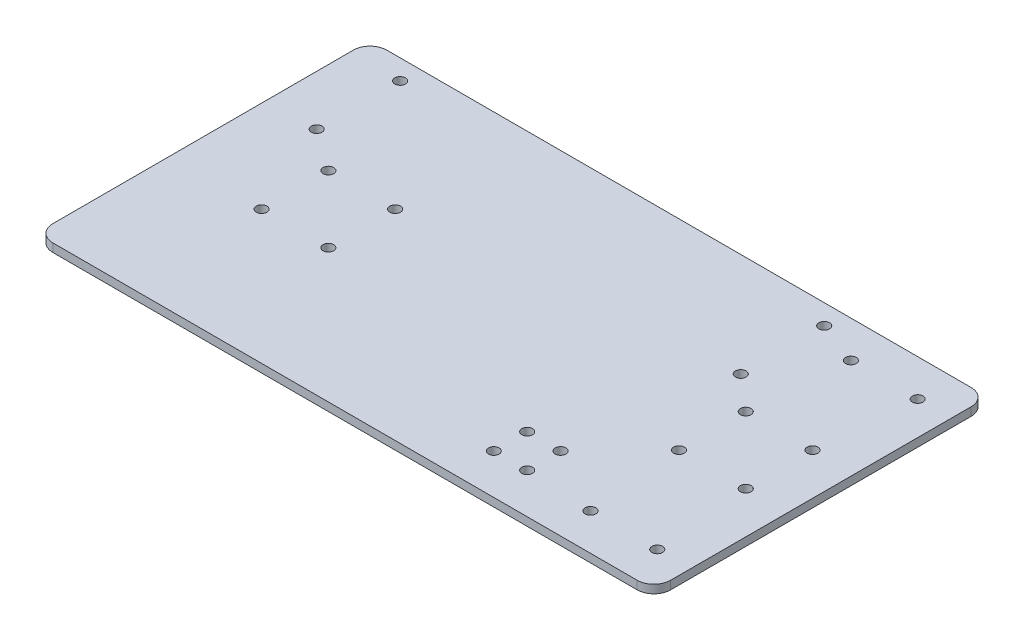
ISO-10303-21;
HEADER;
FILE_DESCRIPTION(('STEP AP214'),'2;1');
FILE_NAME('part.step','',(''),(''),'','','');
FILE_SCHEMA(('AUTOMOTIVE_DESIGN { 1 0 10303 214 1 1 1 1 }'));
ENDSEC;
DATA;
#1=APPLICATION_CONTEXT('core data for automotive mechanical design processes');
#2=APPLICATION_PROTOCOL_DEFINITION('international standard','automotive_design',2000,#1);
#3=PRODUCT_CONTEXT('',#1,'mechanical');
#4=PRODUCT('Part','Part','',(#3));
#5=PRODUCT_RELATED_PRODUCT_CATEGORY('part','',(#4));
#6=PRODUCT_DEFINITION_FORMATION('','',#4);
#7=PRODUCT_DEFINITION_CONTEXT('part definition',#1,'design');
#8=PRODUCT_DEFINITION('design','',#6,#7);
#9=PRODUCT_DEFINITION_SHAPE('','',#8);
#10=(LENGTH_UNIT() NAMED_UNIT(*) SI_UNIT(.MILLI.,.METRE.));
#11=(NAMED_UNIT(*) PLANE_ANGLE_UNIT() SI_UNIT($,.RADIAN.));
#12=(NAMED_UNIT(*) SI_UNIT($,.STERADIAN.) SOLID_ANGLE_UNIT());
#13=UNCERTAINTY_MEASURE_WITH_UNIT(LENGTH_MEASURE(1.E-05),#10,'distance_accuracy_value','');
#14=(GEOMETRIC_REPRESENTATION_CONTEXT(3) GLOBAL_UNCERTAINTY_ASSIGNED_CONTEXT((#13)) GLOBAL_UNIT_ASSIGNED_CONTEXT((#10,
#11,#12)) REPRESENTATION_CONTEXT('',''));
#15=CARTESIAN_POINT('',(0.,0.,0.));
#16=DIRECTION('',(0.,0.,1.));
#17=DIRECTION('',(1.,0.,0.));
#18=AXIS2_PLACEMENT_3D('',#15,#16,#17);
#19=CARTESIAN_POINT('',(117.475,3.175,0.));
#20=DIRECTION('',(1.,0.,0.));
#21=DIRECTION('',(0.,0.,-1.));
#22=AXIS2_PLACEMENT_3D('',#19,#20,#21);
#23=PLANE('',#22);
#24=DIRECTION('',(0.,0.,1.));
#25=VECTOR('',#24,1.);
#26=CARTESIAN_POINT('',(117.475,0.,0.));
#27=LINE('',#26,#25);
#28=CARTESIAN_POINT('',(117.475,0.,-57.15));
#29=VERTEX_POINT('',#28);
#30=CARTESIAN_POINT('',(117.475,0.,57.15));
#31=VERTEX_POINT('',#30);
#32=EDGE_CURVE('E160',#29,#31,#27,.T.);
#33=ORIENTED_EDGE('',*,*,#32,.F.);
#34=DIRECTION('',(0.,-1.,0.));
#35=VECTOR('',#34,1.);
#36=CARTESIAN_POINT('',(117.475,3.175,-57.15));
#37=LINE('',#36,#35);
#38=CARTESIAN_POINT('',(117.475,3.175,-57.15));
#39=VERTEX_POINT('',#38);
#40=EDGE_CURVE('E11',#29,#39,#37,.F.);
#41=ORIENTED_EDGE('',*,*,#40,.T.);
#42=DIRECTION('',(0.,0.,1.));
#43=VECTOR('',#42,1.);
#44=CARTESIAN_POINT('',(117.475,3.175,0.));
#45=LINE('',#44,#43);
#46=CARTESIAN_POINT('',(117.475,3.175,57.15));
#47=VERTEX_POINT('',#46);
#48=EDGE_CURVE('E205',#39,#47,#45,.T.);
#49=ORIENTED_EDGE('',*,*,#48,.T.);
#50=DIRECTION('',(0.,-1.,0.));
#51=VECTOR('',#50,1.);
#52=CARTESIAN_POINT('',(117.475,0.,57.15));
#53=LINE('',#52,#51);
#54=EDGE_CURVE('E56',#47,#31,#53,.T.);
#55=ORIENTED_EDGE('',*,*,#54,.T.);
#56=EDGE_LOOP('',(#33,#41,#49,#55));
#57=FACE_BOUND('',#56,.T.);
#58=ADVANCED_FACE('F51',(#57),#23,.T.);
#59=CARTESIAN_POINT('',(0.,3.175,-63.5));
#60=DIRECTION('',(0.,0.,-1.));
#61=DIRECTION('',(-1.,0.,0.));
#62=AXIS2_PLACEMENT_3D('',#59,#60,#61);
#63=PLANE('',#62);
#64=DIRECTION('',(1.,0.,0.));
#65=VECTOR('',#64,1.);
#66=CARTESIAN_POINT('',(0.,0.,-63.5));
#67=LINE('',#66,#65);
#68=CARTESIAN_POINT('',(-111.125,0.,-63.5));
#69=VERTEX_POINT('',#68);
#70=CARTESIAN_POINT('',(111.125,0.,-63.5));
#71=VERTEX_POINT('',#70);
#72=EDGE_CURVE('E148',#69,#71,#67,.T.);
#73=ORIENTED_EDGE('',*,*,#72,.F.);
#74=DIRECTION('',(0.,-1.,0.));
#75=VECTOR('',#74,1.);
#76=CARTESIAN_POINT('',(-111.125,3.175,-63.5));
#77=LINE('',#76,#75);
#78=CARTESIAN_POINT('',(-111.125,3.175,-63.5));
#79=VERTEX_POINT('',#78);
#80=EDGE_CURVE('E129',#69,#79,#77,.F.);
#81=ORIENTED_EDGE('',*,*,#80,.T.);
#82=DIRECTION('',(1.,0.,0.));
#83=VECTOR('',#82,1.);
#84=CARTESIAN_POINT('',(0.,3.175,-63.5));
#85=LINE('',#84,#83);
#86=CARTESIAN_POINT('',(111.125,3.175,-63.5));
#87=VERTEX_POINT('',#86);
#88=EDGE_CURVE('E287',#79,#87,#85,.T.);
#89=ORIENTED_EDGE('',*,*,#88,.T.);
#90=DIRECTION('',(0.,-1.,0.));
#91=VECTOR('',#90,1.);
#92=CARTESIAN_POINT('',(111.125,3.175,-63.5));
#93=LINE('',#92,#91);
#94=EDGE_CURVE('E134',#87,#71,#93,.T.);
#95=ORIENTED_EDGE('',*,*,#94,.T.);
#96=EDGE_LOOP('',(#73,#81,#89,#95));
#97=FACE_BOUND('',#96,.T.);
#98=ADVANCED_FACE('F422',(#97),#63,.T.);
#99=CARTESIAN_POINT('',(-117.475,3.175,0.));
#100=DIRECTION('',(1.,0.,0.));
#101=DIRECTION('',(0.,0.,-1.));
#102=AXIS2_PLACEMENT_3D('',#99,#100,#101);
#103=PLANE('',#102);
#104=DIRECTION('',(0.,0.,1.));
#105=VECTOR('',#104,1.);
#106=CARTESIAN_POINT('',(-117.475,3.175,0.));
#107=LINE('',#106,#105);
#108=CARTESIAN_POINT('',(-117.475,3.175,-57.15));
#109=VERTEX_POINT('',#108);
#110=CARTESIAN_POINT('',(-117.475,3.175,57.15));
#111=VERTEX_POINT('',#110);
#112=EDGE_CURVE('E138',#109,#111,#107,.T.);
#113=ORIENTED_EDGE('',*,*,#112,.F.);
#114=DIRECTION('',(0.,-1.,0.));
#115=VECTOR('',#114,1.);
#116=CARTESIAN_POINT('',(-117.475,0.,-57.15));
#117=LINE('',#116,#115);
#118=CARTESIAN_POINT('',(-117.475,0.,-57.15));
#119=VERTEX_POINT('',#118);
#120=EDGE_CURVE('E123',#109,#119,#117,.T.);
#121=ORIENTED_EDGE('',*,*,#120,.T.);
#122=DIRECTION('',(0.,0.,1.));
#123=VECTOR('',#122,1.);
#124=CARTESIAN_POINT('',(-117.475,0.,0.));
#125=LINE('',#124,#123);
#126=CARTESIAN_POINT('',(-117.475,0.,57.15));
#127=VERTEX_POINT('',#126);
#128=EDGE_CURVE('E139',#119,#127,#125,.T.);
#129=ORIENTED_EDGE('',*,*,#128,.T.);
#130=DIRECTION('',(0.,-1.,0.));
#131=VECTOR('',#130,1.);
#132=CARTESIAN_POINT('',(-117.475,3.175,57.15));
#133=LINE('',#132,#131);
#134=EDGE_CURVE('E145',#127,#111,#133,.F.);
#135=ORIENTED_EDGE('',*,*,#134,.T.);
#136=EDGE_LOOP('',(#113,#121,#129,#135));
#137=FACE_BOUND('',#136,.T.);
#138=ADVANCED_FACE('F140',(#137),#103,.F.);
#139=CARTESIAN_POINT('',(101.6,3.175,12.7));
#140=DIRECTION('',(0.,-1.,0.));
#141=DIRECTION('',(0.,0.,-1.));
#142=AXIS2_PLACEMENT_3D('',#139,#140,#141);
#143=CYLINDRICAL_SURFACE('',#142,2.03200000000001);
#144=CARTESIAN_POINT('',(101.6,3.175,12.7));
#145=DIRECTION('',(0.,1.,0.));
#146=DIRECTION('',(0.,0.,1.));
#147=AXIS2_PLACEMENT_3D('',#144,#145,#146);
#148=CIRCLE('',#147,2.03200000000001);
#149=CARTESIAN_POINT('',(101.6,3.175,14.732));
#150=VERTEX_POINT('',#149);
#151=EDGE_CURVE('E280',#150,#150,#148,.F.);
#152=ORIENTED_EDGE('',*,*,#151,.F.);
#153=EDGE_LOOP('',(#152));
#154=FACE_BOUND('',#153,.T.);
#155=CARTESIAN_POINT('',(101.6,0.,12.7));
#156=DIRECTION('',(0.,1.,0.));
#157=DIRECTION('',(0.,0.,1.));
#158=AXIS2_PLACEMENT_3D('',#155,#156,#157);
#159=CIRCLE('',#158,2.03200000000001);
#160=CARTESIAN_POINT('',(101.6,0.,14.732));
#161=VERTEX_POINT('',#160);
#162=EDGE_CURVE('E153',#161,#161,#159,.F.);
#163=ORIENTED_EDGE('',*,*,#162,.T.);
#164=EDGE_LOOP('',(#163));
#165=FACE_BOUND('',#164,.T.);
#166=ADVANCED_FACE('F419',(#154,#165),#143,.F.);
#167=CARTESIAN_POINT('',(0.,3.175,63.5));
#168=DIRECTION('',(0.,0.,-1.));
#169=DIRECTION('',(-1.,0.,0.));
#170=AXIS2_PLACEMENT_3D('',#167,#168,#169);
#171=PLANE('',#170);
#172=DIRECTION('',(1.,0.,0.));
#173=VECTOR('',#172,1.);
#174=CARTESIAN_POINT('',(0.,3.175,63.5));
#175=LINE('',#174,#173);
#176=CARTESIAN_POINT('',(-111.125,3.175,63.5));
#177=VERTEX_POINT('',#176);
#178=CARTESIAN_POINT('',(111.125,3.175,63.5));
#179=VERTEX_POINT('',#178);
#180=EDGE_CURVE('E281',#177,#179,#175,.T.);
#181=ORIENTED_EDGE('',*,*,#180,.F.);
#182=DIRECTION('',(0.,-1.,0.));
#183=VECTOR('',#182,1.);
#184=CARTESIAN_POINT('',(-111.125,3.175,63.5));
#185=LINE('',#184,#183);
#186=CARTESIAN_POINT('',(-111.125,0.,63.5));
#187=VERTEX_POINT('',#186);
#188=EDGE_CURVE('E186',#177,#187,#185,.T.);
#189=ORIENTED_EDGE('',*,*,#188,.T.);
#190=DIRECTION('',(1.,0.,0.));
#191=VECTOR('',#190,1.);
#192=CARTESIAN_POINT('',(0.,0.,63.5));
#193=LINE('',#192,#191);
#194=CARTESIAN_POINT('',(111.125,0.,63.5));
#195=VERTEX_POINT('',#194);
#196=EDGE_CURVE('E150',#187,#195,#193,.T.);
#197=ORIENTED_EDGE('',*,*,#196,.T.);
#198=DIRECTION('',(0.,-1.,0.));
#199=VECTOR('',#198,1.);
#200=CARTESIAN_POINT('',(111.125,3.175,63.5));
#201=LINE('',#200,#199);
#202=EDGE_CURVE('E70',#195,#179,#201,.F.);
#203=ORIENTED_EDGE('',*,*,#202,.T.);
#204=EDGE_LOOP('',(#181,#189,#197,#203));
#205=FACE_BOUND('',#204,.T.);
#206=ADVANCED_FACE('F406',(#205),#171,.F.);
#207=CARTESIAN_POINT('',(79.375,3.175,-49.53));
#208=DIRECTION('',(0.,-1.,0.));
#209=DIRECTION('',(0.,0.,-1.));
#210=AXIS2_PLACEMENT_3D('',#207,#208,#209);
#211=CYLINDRICAL_SURFACE('',#210,2.03200000000001);
#212=CARTESIAN_POINT('',(79.375,3.175,-49.53));
#213=DIRECTION('',(0.,1.,0.));
#214=DIRECTION('',(0.,0.,1.));
#215=AXIS2_PLACEMENT_3D('',#212,#213,#214);
#216=CIRCLE('',#215,2.03200000000001);
#217=CARTESIAN_POINT('',(79.375,3.175,-47.498));
#218=VERTEX_POINT('',#217);
#219=EDGE_CURVE('E293',#218,#218,#216,.T.);
#220=ORIENTED_EDGE('',*,*,#219,.T.);
#221=EDGE_LOOP('',(#220));
#222=FACE_BOUND('',#221,.T.);
#223=CARTESIAN_POINT('',(79.375,0.,-49.53));
#224=DIRECTION('',(0.,1.,0.));
#225=DIRECTION('',(0.,0.,1.));
#226=AXIS2_PLACEMENT_3D('',#223,#224,#225);
#227=CIRCLE('',#226,2.03200000000001);
#228=CARTESIAN_POINT('',(79.375,0.,-47.498));
#229=VERTEX_POINT('',#228);
#230=EDGE_CURVE('E207',#229,#229,#227,.T.);
#231=ORIENTED_EDGE('',*,*,#230,.F.);
#232=EDGE_LOOP('',(#231));
#233=FACE_BOUND('',#232,.T.);
#234=ADVANCED_FACE('F404',(#222,#233),#211,.F.);
#235=CARTESIAN_POINT('',(79.375,3.175,49.53));
#236=DIRECTION('',(0.,-1.,0.));
#237=DIRECTION('',(0.,0.,-1.));
#238=AXIS2_PLACEMENT_3D('',#235,#236,#237);
#239=CYLINDRICAL_SURFACE('',#238,2.03200000000001);
#240=CARTESIAN_POINT('',(79.375,3.175,49.53));
#241=DIRECTION('',(0.,1.,0.));
#242=DIRECTION('',(0.,0.,1.));
#243=AXIS2_PLACEMENT_3D('',#240,#241,#242);
#244=CIRCLE('',#243,2.03200000000001);
#245=CARTESIAN_POINT('',(79.375,3.175,51.562));
#246=VERTEX_POINT('',#245);
#247=EDGE_CURVE('E295',#246,#246,#244,.T.);
#248=ORIENTED_EDGE('',*,*,#247,.T.);
#249=EDGE_LOOP('',(#248));
#250=FACE_BOUND('',#249,.T.);
#251=CARTESIAN_POINT('',(79.375,0.,49.53));
#252=DIRECTION('',(0.,1.,0.));
#253=DIRECTION('',(0.,0.,1.));
#254=AXIS2_PLACEMENT_3D('',#251,#252,#253);
#255=CIRCLE('',#254,2.03200000000001);
#256=CARTESIAN_POINT('',(79.375,0.,51.562));
#257=VERTEX_POINT('',#256);
#258=EDGE_CURVE('E208',#257,#257,#255,.T.);
#259=ORIENTED_EDGE('',*,*,#258,.F.);
#260=EDGE_LOOP('',(#259));
#261=FACE_BOUND('',#260,.T.);
#262=ADVANCED_FACE('F409',(#250,#261),#239,.F.);
#263=CARTESIAN_POINT('',(104.775,3.175,49.53));
#264=DIRECTION('',(0.,-1.,0.));
#265=DIRECTION('',(0.,0.,-1.));
#266=AXIS2_PLACEMENT_3D('',#263,#264,#265);
#267=CYLINDRICAL_SURFACE('',#266,2.03200000000001);
#268=CARTESIAN_POINT('',(104.775,3.175,49.53));
#269=DIRECTION('',(0.,1.,0.));
#270=DIRECTION('',(0.,0.,1.));
#271=AXIS2_PLACEMENT_3D('',#268,#269,#270);
#272=CIRCLE('',#271,2.03200000000001);
#273=CARTESIAN_POINT('',(104.775,3.175,51.562));
#274=VERTEX_POINT('',#273);
#275=EDGE_CURVE('E296',#274,#274,#272,.T.);
#276=ORIENTED_EDGE('',*,*,#275,.T.);
#277=EDGE_LOOP('',(#276));
#278=FACE_BOUND('',#277,.T.);
#279=CARTESIAN_POINT('',(104.775,0.,49.53));
#280=DIRECTION('',(0.,1.,0.));
#281=DIRECTION('',(0.,0.,1.));
#282=AXIS2_PLACEMENT_3D('',#279,#280,#281);
#283=CIRCLE('',#282,2.03200000000001);
#284=CARTESIAN_POINT('',(104.775,0.,51.562));
#285=VERTEX_POINT('',#284);
#286=EDGE_CURVE('E219',#285,#285,#283,.T.);
#287=ORIENTED_EDGE('',*,*,#286,.F.);
#288=EDGE_LOOP('',(#287));
#289=FACE_BOUND('',#288,.T.);
#290=ADVANCED_FACE('F413',(#278,#289),#267,.F.);
#291=CARTESIAN_POINT('',(104.775,3.175,-49.53));
#292=DIRECTION('',(0.,-1.,0.));
#293=DIRECTION('',(0.,0.,-1.));
#294=AXIS2_PLACEMENT_3D('',#291,#292,#293);
#295=CYLINDRICAL_SURFACE('',#294,2.03200000000001);
#296=CARTESIAN_POINT('',(104.775,3.175,-49.53));
#297=DIRECTION('',(0.,1.,0.));
#298=DIRECTION('',(0.,0.,1.));
#299=AXIS2_PLACEMENT_3D('',#296,#297,#298);
#300=CIRCLE('',#299,2.03200000000001);
#301=CARTESIAN_POINT('',(104.775,3.175,-47.498));
#302=VERTEX_POINT('',#301);
#303=EDGE_CURVE('E305',#302,#302,#300,.T.);
#304=ORIENTED_EDGE('',*,*,#303,.T.);
#305=EDGE_LOOP('',(#304));
#306=FACE_BOUND('',#305,.T.);
#307=CARTESIAN_POINT('',(104.775,0.,-49.53));
#308=DIRECTION('',(0.,1.,0.));
#309=DIRECTION('',(0.,0.,1.));
#310=AXIS2_PLACEMENT_3D('',#307,#308,#309);
#311=CIRCLE('',#310,2.03200000000001);
#312=CARTESIAN_POINT('',(104.775,0.,-47.498));
#313=VERTEX_POINT('',#312);
#314=EDGE_CURVE('E217',#313,#313,#311,.T.);
#315=ORIENTED_EDGE('',*,*,#314,.F.);
#316=EDGE_LOOP('',(#315));
#317=FACE_BOUND('',#316,.T.);
#318=ADVANCED_FACE('F590',(#306,#317),#295,.F.);
#319=CARTESIAN_POINT('',(53.975,3.175,35.4965));
#320=DIRECTION('',(0.,-1.,0.));
#321=DIRECTION('',(0.,0.,-1.));
#322=AXIS2_PLACEMENT_3D('',#319,#320,#321);
#323=CYLINDRICAL_SURFACE('',#322,2.03200000000001);
#324=CARTESIAN_POINT('',(53.975,3.175,35.4965));
#325=DIRECTION('',(0.,1.,0.));
#326=DIRECTION('',(0.,0.,1.));
#327=AXIS2_PLACEMENT_3D('',#324,#325,#326);
#328=CIRCLE('',#327,2.03200000000001);
#329=CARTESIAN_POINT('',(53.975,3.175,37.5285));
#330=VERTEX_POINT('',#329);
#331=EDGE_CURVE('E304',#330,#330,#328,.T.);
#332=ORIENTED_EDGE('',*,*,#331,.T.);
#333=EDGE_LOOP('',(#332));
#334=FACE_BOUND('',#333,.T.);
#335=CARTESIAN_POINT('',(53.975,0.,35.4965));
#336=DIRECTION('',(0.,1.,0.));
#337=DIRECTION('',(0.,0.,1.));
#338=AXIS2_PLACEMENT_3D('',#335,#336,#337);
#339=CIRCLE('',#338,2.03200000000001);
#340=CARTESIAN_POINT('',(53.975,0.,37.5285));
#341=VERTEX_POINT('',#340);
#342=EDGE_CURVE('E224',#341,#341,#339,.T.);
#343=ORIENTED_EDGE('',*,*,#342,.F.);
#344=EDGE_LOOP('',(#343));
#345=FACE_BOUND('',#344,.T.);
#346=ADVANCED_FACE('F583',(#334,#345),#323,.F.);
#347=CARTESIAN_POINT('',(41.275,3.175,35.4965));
#348=DIRECTION('',(0.,-1.,0.));
#349=DIRECTION('',(0.,0.,-1.));
#350=AXIS2_PLACEMENT_3D('',#347,#348,#349);
#351=CYLINDRICAL_SURFACE('',#350,2.03200000000002);
#352=CARTESIAN_POINT('',(41.275,3.175,35.4965));
#353=DIRECTION('',(0.,1.,0.));
#354=DIRECTION('',(0.,0.,1.));
#355=AXIS2_PLACEMENT_3D('',#352,#353,#354);
#356=CIRCLE('',#355,2.03200000000002);
#357=CARTESIAN_POINT('',(41.275,3.175,37.5285));
#358=VERTEX_POINT('',#357);
#359=EDGE_CURVE('E308',#358,#358,#356,.T.);
#360=ORIENTED_EDGE('',*,*,#359,.T.);
#361=EDGE_LOOP('',(#360));
#362=FACE_BOUND('',#361,.T.);
#363=CARTESIAN_POINT('',(41.275,0.,35.4965));
#364=DIRECTION('',(0.,1.,0.));
#365=DIRECTION('',(0.,0.,1.));
#366=AXIS2_PLACEMENT_3D('',#363,#364,#365);
#367=CIRCLE('',#366,2.03200000000002);
#368=CARTESIAN_POINT('',(41.275,0.,37.5285));
#369=VERTEX_POINT('',#368);
#370=EDGE_CURVE('E227',#369,#369,#367,.T.);
#371=ORIENTED_EDGE('',*,*,#370,.F.);
#372=EDGE_LOOP('',(#371));
#373=FACE_BOUND('',#372,.T.);
#374=ADVANCED_FACE('F578',(#362,#373),#351,.F.);
#375=CARTESIAN_POINT('',(41.275,3.175,48.1965));
#376=DIRECTION('',(0.,-1.,0.));
#377=DIRECTION('',(0.,0.,-1.));
#378=AXIS2_PLACEMENT_3D('',#375,#376,#377);
#379=CYLINDRICAL_SURFACE('',#378,2.032);
#380=CARTESIAN_POINT('',(41.275,3.175,48.1965));
#381=DIRECTION('',(0.,1.,0.));
#382=DIRECTION('',(0.,0.,1.));
#383=AXIS2_PLACEMENT_3D('',#380,#381,#382);
#384=CIRCLE('',#383,2.032);
#385=CARTESIAN_POINT('',(41.275,3.175,50.2285));
#386=VERTEX_POINT('',#385);
#387=EDGE_CURVE('E315',#386,#386,#384,.T.);
#388=ORIENTED_EDGE('',*,*,#387,.T.);
#389=EDGE_LOOP('',(#388));
#390=FACE_BOUND('',#389,.T.);
#391=CARTESIAN_POINT('',(41.275,0.,48.1965));
#392=DIRECTION('',(0.,1.,0.));
#393=DIRECTION('',(0.,0.,1.));
#394=AXIS2_PLACEMENT_3D('',#391,#392,#393);
#395=CIRCLE('',#394,2.032);
#396=CARTESIAN_POINT('',(41.275,0.,50.2285));
#397=VERTEX_POINT('',#396);
#398=EDGE_CURVE('E233',#397,#397,#395,.T.);
#399=ORIENTED_EDGE('',*,*,#398,.F.);
#400=EDGE_LOOP('',(#399));
#401=FACE_BOUND('',#400,.T.);
#402=ADVANCED_FACE('F577',(#390,#401),#379,.F.);
#403=CARTESIAN_POINT('',(53.975,3.175,48.1965));
#404=DIRECTION('',(0.,-1.,0.));
#405=DIRECTION('',(0.,0.,-1.));
#406=AXIS2_PLACEMENT_3D('',#403,#404,#405);
#407=CYLINDRICAL_SURFACE('',#406,2.032);
#408=CARTESIAN_POINT('',(53.975,3.175,48.1965));
#409=DIRECTION('',(0.,1.,0.));
#410=DIRECTION('',(0.,0.,1.));
#411=AXIS2_PLACEMENT_3D('',#408,#409,#410);
#412=CIRCLE('',#411,2.032);
#413=CARTESIAN_POINT('',(53.975,3.175,50.2285));
#414=VERTEX_POINT('',#413);
#415=EDGE_CURVE('E317',#414,#414,#412,.T.);
#416=ORIENTED_EDGE('',*,*,#415,.T.);
#417=EDGE_LOOP('',(#416));
#418=FACE_BOUND('',#417,.T.);
#419=CARTESIAN_POINT('',(53.975,0.,48.1965));
#420=DIRECTION('',(0.,1.,0.));
#421=DIRECTION('',(0.,0.,1.));
#422=AXIS2_PLACEMENT_3D('',#419,#420,#421);
#423=CIRCLE('',#422,2.032);
#424=CARTESIAN_POINT('',(53.975,0.,50.2285));
#425=VERTEX_POINT('',#424);
#426=EDGE_CURVE('E232',#425,#425,#423,.T.);
#427=ORIENTED_EDGE('',*,*,#426,.F.);
#428=EDGE_LOOP('',(#427));
#429=FACE_BOUND('',#428,.T.);
#430=ADVANCED_FACE('F575',(#418,#429),#407,.F.);
#431=CARTESIAN_POINT('',(-98.425,3.175,-55.88));
#432=DIRECTION('',(0.,-1.,0.));
#433=DIRECTION('',(0.,0.,-1.));
#434=AXIS2_PLACEMENT_3D('',#431,#432,#433);
#435=CYLINDRICAL_SURFACE('',#434,2.03199999999999);
#436=CARTESIAN_POINT('',(-98.425,3.175,-55.88));
#437=DIRECTION('',(0.,1.,0.));
#438=DIRECTION('',(0.,0.,1.));
#439=AXIS2_PLACEMENT_3D('',#436,#437,#438);
#440=CIRCLE('',#439,2.03199999999999);
#441=CARTESIAN_POINT('',(-98.425,3.175,-53.848));
#442=VERTEX_POINT('',#441);
#443=EDGE_CURVE('E318',#442,#442,#440,.T.);
#444=ORIENTED_EDGE('',*,*,#443,.T.);
#445=EDGE_LOOP('',(#444));
#446=FACE_BOUND('',#445,.T.);
#447=CARTESIAN_POINT('',(-98.425,0.,-55.88));
#448=DIRECTION('',(0.,1.,0.));
#449=DIRECTION('',(0.,0.,1.));
#450=AXIS2_PLACEMENT_3D('',#447,#448,#449);
#451=CIRCLE('',#450,2.03199999999999);
#452=CARTESIAN_POINT('',(-98.425,0.,-53.848));
#453=VERTEX_POINT('',#452);
#454=EDGE_CURVE('E238',#453,#453,#451,.T.);
#455=ORIENTED_EDGE('',*,*,#454,.F.);
#456=EDGE_LOOP('',(#455));
#457=FACE_BOUND('',#456,.T.);
#458=ADVANCED_FACE('F568',(#446,#457),#435,.F.);
#459=CARTESIAN_POINT('',(-98.425,3.175,-24.13));
#460=DIRECTION('',(0.,-1.,0.));
#461=DIRECTION('',(0.,0.,-1.));
#462=AXIS2_PLACEMENT_3D('',#459,#460,#461);
#463=CYLINDRICAL_SURFACE('',#462,2.03200000000001);
#464=CARTESIAN_POINT('',(-98.425,3.175,-24.13));
#465=DIRECTION('',(0.,1.,0.));
#466=DIRECTION('',(0.,0.,1.));
#467=AXIS2_PLACEMENT_3D('',#464,#465,#466);
#468=CIRCLE('',#467,2.03200000000001);
#469=CARTESIAN_POINT('',(-98.425,3.175,-22.098));
#470=VERTEX_POINT('',#469);
#471=EDGE_CURVE('E325',#470,#470,#468,.T.);
#472=ORIENTED_EDGE('',*,*,#471,.T.);
#473=EDGE_LOOP('',(#472));
#474=FACE_BOUND('',#473,.T.);
#475=CARTESIAN_POINT('',(-98.425,0.,-24.13));
#476=DIRECTION('',(0.,1.,0.));
#477=DIRECTION('',(0.,0.,1.));
#478=AXIS2_PLACEMENT_3D('',#475,#476,#477);
#479=CIRCLE('',#478,2.03200000000001);
#480=CARTESIAN_POINT('',(-98.425,0.,-22.098));
#481=VERTEX_POINT('',#480);
#482=EDGE_CURVE('E241',#481,#481,#479,.T.);
#483=ORIENTED_EDGE('',*,*,#482,.F.);
#484=EDGE_LOOP('',(#483));
#485=FACE_BOUND('',#484,.T.);
#486=ADVANCED_FACE('F562',(#474,#485),#463,.F.);
#487=CARTESIAN_POINT('',(62.865,3.175,-55.88));
#488=DIRECTION('',(0.,-1.,0.));
#489=DIRECTION('',(0.,0.,-1.));
#490=AXIS2_PLACEMENT_3D('',#487,#488,#489);
#491=CYLINDRICAL_SURFACE('',#490,2.03200000000001);
#492=CARTESIAN_POINT('',(62.865,3.175,-55.88));
#493=DIRECTION('',(0.,1.,0.));
#494=DIRECTION('',(0.,0.,1.));
#495=AXIS2_PLACEMENT_3D('',#492,#493,#494);
#496=CIRCLE('',#495,2.03200000000001);
#497=CARTESIAN_POINT('',(62.865,3.175,-53.848));
#498=VERTEX_POINT('',#497);
#499=EDGE_CURVE('E329',#498,#498,#496,.T.);
#500=ORIENTED_EDGE('',*,*,#499,.T.);
#501=EDGE_LOOP('',(#500));
#502=FACE_BOUND('',#501,.T.);
#503=CARTESIAN_POINT('',(62.865,0.,-55.88));
#504=DIRECTION('',(0.,1.,0.));
#505=DIRECTION('',(0.,0.,1.));
#506=AXIS2_PLACEMENT_3D('',#503,#504,#505);
#507=CIRCLE('',#506,2.03200000000001);
#508=CARTESIAN_POINT('',(62.865,0.,-53.848));
#509=VERTEX_POINT('',#508);
#510=EDGE_CURVE('E242',#509,#509,#507,.T.);
#511=ORIENTED_EDGE('',*,*,#510,.F.);
#512=EDGE_LOOP('',(#511));
#513=FACE_BOUND('',#512,.T.);
#514=ADVANCED_FACE('F557',(#502,#513),#491,.F.);
#515=CARTESIAN_POINT('',(62.865,3.175,-24.13));
#516=DIRECTION('',(0.,-1.,0.));
#517=DIRECTION('',(0.,0.,-1.));
#518=AXIS2_PLACEMENT_3D('',#515,#516,#517);
#519=CYLINDRICAL_SURFACE('',#518,2.03200000000001);
#520=CARTESIAN_POINT('',(62.865,3.175,-24.13));
#521=DIRECTION('',(0.,1.,0.));
#522=DIRECTION('',(0.,0.,1.));
#523=AXIS2_PLACEMENT_3D('',#520,#521,#522);
#524=CIRCLE('',#523,2.03200000000001);
#525=CARTESIAN_POINT('',(62.865,3.175,-22.098));
#526=VERTEX_POINT('',#525);
#527=EDGE_CURVE('E327',#526,#526,#524,.T.);
#528=ORIENTED_EDGE('',*,*,#527,.T.);
#529=EDGE_LOOP('',(#528));
#530=FACE_BOUND('',#529,.T.);
#531=CARTESIAN_POINT('',(62.865,0.,-24.13));
#532=DIRECTION('',(0.,1.,0.));
#533=DIRECTION('',(0.,0.,1.));
#534=AXIS2_PLACEMENT_3D('',#531,#532,#533);
#535=CIRCLE('',#534,2.03200000000001);
#536=CARTESIAN_POINT('',(62.865,0.,-22.098));
#537=VERTEX_POINT('',#536);
#538=EDGE_CURVE('E247',#537,#537,#535,.T.);
#539=ORIENTED_EDGE('',*,*,#538,.F.);
#540=EDGE_LOOP('',(#539));
#541=FACE_BOUND('',#540,.T.);
#542=ADVANCED_FACE('F560',(#530,#541),#519,.F.);
#543=CARTESIAN_POINT('',(-82.55,3.175,-12.7));
#544=DIRECTION('',(0.,-1.,0.));
#545=DIRECTION('',(0.,0.,-1.));
#546=AXIS2_PLACEMENT_3D('',#543,#544,#545);
#547=CYLINDRICAL_SURFACE('',#546,2.03200000000001);
#548=CARTESIAN_POINT('',(-82.55,3.175,-12.7));
#549=DIRECTION('',(0.,1.,0.));
#550=DIRECTION('',(0.,0.,1.));
#551=AXIS2_PLACEMENT_3D('',#548,#549,#550);
#552=CIRCLE('',#551,2.03200000000001);
#553=CARTESIAN_POINT('',(-82.55,3.175,-10.668));
#554=VERTEX_POINT('',#553);
#555=EDGE_CURVE('E334',#554,#554,#552,.T.);
#556=ORIENTED_EDGE('',*,*,#555,.T.);
#557=EDGE_LOOP('',(#556));
#558=FACE_BOUND('',#557,.T.);
#559=CARTESIAN_POINT('',(-82.55,0.,-12.7));
#560=DIRECTION('',(0.,1.,0.));
#561=DIRECTION('',(0.,0.,1.));
#562=AXIS2_PLACEMENT_3D('',#559,#560,#561);
#563=CIRCLE('',#562,2.03200000000001);
#564=CARTESIAN_POINT('',(-82.55,0.,-10.668));
#565=VERTEX_POINT('',#564);
#566=EDGE_CURVE('E255',#565,#565,#563,.T.);
#567=ORIENTED_EDGE('',*,*,#566,.F.);
#568=EDGE_LOOP('',(#567));
#569=FACE_BOUND('',#568,.T.);
#570=ADVANCED_FACE('F456',(#558,#569),#547,.F.);
#571=CARTESIAN_POINT('',(-57.15,3.175,-12.7));
#572=DIRECTION('',(0.,-1.,0.));
#573=DIRECTION('',(0.,0.,-1.));
#574=AXIS2_PLACEMENT_3D('',#571,#572,#573);
#575=CYLINDRICAL_SURFACE('',#574,2.03200000000001);
#576=CARTESIAN_POINT('',(-57.15,3.175,-12.7));
#577=DIRECTION('',(0.,1.,0.));
#578=DIRECTION('',(0.,0.,1.));
#579=AXIS2_PLACEMENT_3D('',#576,#577,#578);
#580=CIRCLE('',#579,2.03200000000001);
#581=CARTESIAN_POINT('',(-57.15,3.175,-10.668));
#582=VERTEX_POINT('',#581);
#583=EDGE_CURVE('E337',#582,#582,#580,.T.);
#584=ORIENTED_EDGE('',*,*,#583,.T.);
#585=EDGE_LOOP('',(#584));
#586=FACE_BOUND('',#585,.T.);
#587=CARTESIAN_POINT('',(-57.15,0.,-12.7));
#588=DIRECTION('',(0.,1.,0.));
#589=DIRECTION('',(0.,0.,1.));
#590=AXIS2_PLACEMENT_3D('',#587,#588,#589);
#591=CIRCLE('',#590,2.03200000000001);
#592=CARTESIAN_POINT('',(-57.15,0.,-10.668));
#593=VERTEX_POINT('',#592);
#594=EDGE_CURVE('E253',#593,#593,#591,.T.);
#595=ORIENTED_EDGE('',*,*,#594,.F.);
#596=EDGE_LOOP('',(#595));
#597=FACE_BOUND('',#596,.T.);
#598=ADVANCED_FACE('F452',(#586,#597),#575,.F.);
#599=CARTESIAN_POINT('',(-82.55,3.175,12.7));
#600=DIRECTION('',(0.,-1.,0.));
#601=DIRECTION('',(0.,0.,-1.));
#602=AXIS2_PLACEMENT_3D('',#599,#600,#601);
#603=CYLINDRICAL_SURFACE('',#602,2.03200000000001);
#604=CARTESIAN_POINT('',(-82.55,3.175,12.7));
#605=DIRECTION('',(0.,1.,0.));
#606=DIRECTION('',(0.,0.,1.));
#607=AXIS2_PLACEMENT_3D('',#604,#605,#606);
#608=CIRCLE('',#607,2.03200000000001);
#609=CARTESIAN_POINT('',(-82.55,3.175,14.732));
#610=VERTEX_POINT('',#609);
#611=EDGE_CURVE('E338',#610,#610,#608,.T.);
#612=ORIENTED_EDGE('',*,*,#611,.T.);
#613=EDGE_LOOP('',(#612));
#614=FACE_BOUND('',#613,.T.);
#615=CARTESIAN_POINT('',(-82.55,0.,12.7));
#616=DIRECTION('',(0.,1.,0.));
#617=DIRECTION('',(0.,0.,1.));
#618=AXIS2_PLACEMENT_3D('',#615,#616,#617);
#619=CIRCLE('',#618,2.03200000000001);
#620=CARTESIAN_POINT('',(-82.55,0.,14.732));
#621=VERTEX_POINT('',#620);
#622=EDGE_CURVE('E258',#621,#621,#619,.T.);
#623=ORIENTED_EDGE('',*,*,#622,.F.);
#624=EDGE_LOOP('',(#623));
#625=FACE_BOUND('',#624,.T.);
#626=ADVANCED_FACE('F449',(#614,#625),#603,.F.);
#627=CARTESIAN_POINT('',(-57.15,3.175,12.7));
#628=DIRECTION('',(0.,-1.,0.));
#629=DIRECTION('',(0.,0.,-1.));
#630=AXIS2_PLACEMENT_3D('',#627,#628,#629);
#631=CYLINDRICAL_SURFACE('',#630,2.03200000000001);
#632=CARTESIAN_POINT('',(-57.15,3.175,12.7));
#633=DIRECTION('',(0.,1.,0.));
#634=DIRECTION('',(0.,0.,1.));
#635=AXIS2_PLACEMENT_3D('',#632,#633,#634);
#636=CIRCLE('',#635,2.03200000000001);
#637=CARTESIAN_POINT('',(-57.15,3.175,14.732));
#638=VERTEX_POINT('',#637);
#639=EDGE_CURVE('E343',#638,#638,#636,.T.);
#640=ORIENTED_EDGE('',*,*,#639,.T.);
#641=EDGE_LOOP('',(#640));
#642=FACE_BOUND('',#641,.T.);
#643=CARTESIAN_POINT('',(-57.15,0.,12.7));
#644=DIRECTION('',(0.,1.,0.));
#645=DIRECTION('',(0.,0.,1.));
#646=AXIS2_PLACEMENT_3D('',#643,#644,#645);
#647=CIRCLE('',#646,2.03200000000001);
#648=CARTESIAN_POINT('',(-57.15,0.,14.732));
#649=VERTEX_POINT('',#648);
#650=EDGE_CURVE('E265',#649,#649,#647,.T.);
#651=ORIENTED_EDGE('',*,*,#650,.F.);
#652=EDGE_LOOP('',(#651));
#653=FACE_BOUND('',#652,.T.);
#654=ADVANCED_FACE('F444',(#642,#653),#631,.F.);
#655=CARTESIAN_POINT('',(76.2,3.175,12.7));
#656=DIRECTION('',(0.,-1.,0.));
#657=DIRECTION('',(0.,0.,-1.));
#658=AXIS2_PLACEMENT_3D('',#655,#656,#657);
#659=CYLINDRICAL_SURFACE('',#658,2.03200000000001);
#660=CARTESIAN_POINT('',(76.2,3.175,12.7));
#661=DIRECTION('',(0.,1.,0.));
#662=DIRECTION('',(0.,0.,1.));
#663=AXIS2_PLACEMENT_3D('',#660,#661,#662);
#664=CIRCLE('',#663,2.03200000000001);
#665=CARTESIAN_POINT('',(76.2,3.175,14.732));
#666=VERTEX_POINT('',#665);
#667=EDGE_CURVE('E350',#666,#666,#664,.F.);
#668=ORIENTED_EDGE('',*,*,#667,.F.);
#669=EDGE_LOOP('',(#668));
#670=FACE_BOUND('',#669,.T.);
#671=CARTESIAN_POINT('',(76.2,0.,12.7));
#672=DIRECTION('',(0.,1.,0.));
#673=DIRECTION('',(0.,0.,1.));
#674=AXIS2_PLACEMENT_3D('',#671,#672,#673);
#675=CIRCLE('',#674,2.03200000000001);
#676=CARTESIAN_POINT('',(76.2,0.,14.732));
#677=VERTEX_POINT('',#676);
#678=EDGE_CURVE('E270',#677,#677,#675,.F.);
#679=ORIENTED_EDGE('',*,*,#678,.T.);
#680=EDGE_LOOP('',(#679));
#681=FACE_BOUND('',#680,.T.);
#682=ADVANCED_FACE('F361',(#670,#681),#659,.F.);
#683=CARTESIAN_POINT('',(76.2,3.175,-12.7));
#684=DIRECTION('',(0.,-1.,0.));
#685=DIRECTION('',(0.,0.,-1.));
#686=AXIS2_PLACEMENT_3D('',#683,#684,#685);
#687=CYLINDRICAL_SURFACE('',#686,2.03200000000001);
#688=CARTESIAN_POINT('',(76.2,3.175,-12.7));
#689=DIRECTION('',(0.,1.,0.));
#690=DIRECTION('',(0.,0.,1.));
#691=AXIS2_PLACEMENT_3D('',#688,#689,#690);
#692=CIRCLE('',#691,2.03200000000001);
#693=CARTESIAN_POINT('',(76.2,3.175,-10.668));
#694=VERTEX_POINT('',#693);
#695=EDGE_CURVE('E166',#694,#694,#692,.F.);
#696=ORIENTED_EDGE('',*,*,#695,.F.);
#697=EDGE_LOOP('',(#696));
#698=FACE_BOUND('',#697,.T.);
#699=CARTESIAN_POINT('',(76.2,0.,-12.7));
#700=DIRECTION('',(0.,1.,0.));
#701=DIRECTION('',(0.,0.,1.));
#702=AXIS2_PLACEMENT_3D('',#699,#700,#701);
#703=CIRCLE('',#702,2.03200000000001);
#704=CARTESIAN_POINT('',(76.2,0.,-10.668));
#705=VERTEX_POINT('',#704);
#706=EDGE_CURVE('E272',#705,#705,#703,.F.);
#707=ORIENTED_EDGE('',*,*,#706,.T.);
#708=EDGE_LOOP('',(#707));
#709=FACE_BOUND('',#708,.T.);
#710=ADVANCED_FACE('F360',(#698,#709),#687,.F.);
#711=CARTESIAN_POINT('',(101.6,3.175,-12.7));
#712=DIRECTION('',(0.,-1.,0.));
#713=DIRECTION('',(0.,0.,-1.));
#714=AXIS2_PLACEMENT_3D('',#711,#712,#713);
#715=CYLINDRICAL_SURFACE('',#714,2.03200000000001);
#716=CARTESIAN_POINT('',(101.6,3.175,-12.7));
#717=DIRECTION('',(0.,1.,0.));
#718=DIRECTION('',(0.,0.,1.));
#719=AXIS2_PLACEMENT_3D('',#716,#717,#718);
#720=CIRCLE('',#719,2.03200000000001);
#721=CARTESIAN_POINT('',(101.6,3.175,-10.668));
#722=VERTEX_POINT('',#721);
#723=EDGE_CURVE('E169',#722,#722,#720,.F.);
#724=ORIENTED_EDGE('',*,*,#723,.F.);
#725=EDGE_LOOP('',(#724));
#726=FACE_BOUND('',#725,.T.);
#727=CARTESIAN_POINT('',(101.6,0.,-12.7));
#728=DIRECTION('',(0.,1.,0.));
#729=DIRECTION('',(0.,0.,1.));
#730=AXIS2_PLACEMENT_3D('',#727,#728,#729);
#731=CIRCLE('',#730,2.03200000000001);
#732=CARTESIAN_POINT('',(101.6,0.,-10.668));
#733=VERTEX_POINT('',#732);
#734=EDGE_CURVE('E165',#733,#733,#731,.F.);
#735=ORIENTED_EDGE('',*,*,#734,.T.);
#736=EDGE_LOOP('',(#735));
#737=FACE_BOUND('',#736,.T.);
#738=ADVANCED_FACE('F365',(#726,#737),#715,.F.);
#739=CARTESIAN_POINT('',(0.,3.175,0.));
#740=DIRECTION('',(0.,1.,0.));
#741=DIRECTION('',(0.,0.,1.));
#742=AXIS2_PLACEMENT_3D('',#739,#740,#741);
#743=PLANE('',#742);
#744=ORIENTED_EDGE('',*,*,#695,.T.);
#745=EDGE_LOOP('',(#744));
#746=FACE_BOUND('',#745,.T.);
#747=ORIENTED_EDGE('',*,*,#667,.T.);
#748=EDGE_LOOP('',(#747));
#749=FACE_BOUND('',#748,.T.);
#750=ORIENTED_EDGE('',*,*,#639,.F.);
#751=EDGE_LOOP('',(#750));
#752=FACE_BOUND('',#751,.T.);
#753=ORIENTED_EDGE('',*,*,#611,.F.);
#754=EDGE_LOOP('',(#753));
#755=FACE_BOUND('',#754,.T.);
#756=ORIENTED_EDGE('',*,*,#583,.F.);
#757=EDGE_LOOP('',(#756));
#758=FACE_BOUND('',#757,.T.);
#759=ORIENTED_EDGE('',*,*,#555,.F.);
#760=EDGE_LOOP('',(#759));
#761=FACE_BOUND('',#760,.T.);
#762=ORIENTED_EDGE('',*,*,#527,.F.);
#763=EDGE_LOOP('',(#762));
#764=FACE_BOUND('',#763,.T.);
#765=ORIENTED_EDGE('',*,*,#499,.F.);
#766=EDGE_LOOP('',(#765));
#767=FACE_BOUND('',#766,.T.);
#768=ORIENTED_EDGE('',*,*,#471,.F.);
#769=EDGE_LOOP('',(#768));
#770=FACE_BOUND('',#769,.T.);
#771=ORIENTED_EDGE('',*,*,#443,.F.);
#772=EDGE_LOOP('',(#771));
#773=FACE_BOUND('',#772,.T.);
#774=ORIENTED_EDGE('',*,*,#415,.F.);
#775=EDGE_LOOP('',(#774));
#776=FACE_BOUND('',#775,.T.);
#777=ORIENTED_EDGE('',*,*,#387,.F.);
#778=EDGE_LOOP('',(#777));
#779=FACE_BOUND('',#778,.T.);
#780=ORIENTED_EDGE('',*,*,#359,.F.);
#781=EDGE_LOOP('',(#780));
#782=FACE_BOUND('',#781,.T.);
#783=ORIENTED_EDGE('',*,*,#331,.F.);
#784=EDGE_LOOP('',(#783));
#785=FACE_BOUND('',#784,.T.);
#786=ORIENTED_EDGE('',*,*,#303,.F.);
#787=EDGE_LOOP('',(#786));
#788=FACE_BOUND('',#787,.T.);
#789=ORIENTED_EDGE('',*,*,#275,.F.);
#790=EDGE_LOOP('',(#789));
#791=FACE_BOUND('',#790,.T.);
#792=ORIENTED_EDGE('',*,*,#247,.F.);
#793=EDGE_LOOP('',(#792));
#794=FACE_BOUND('',#793,.T.);
#795=ORIENTED_EDGE('',*,*,#219,.F.);
#796=EDGE_LOOP('',(#795));
#797=FACE_BOUND('',#796,.T.);
#798=ORIENTED_EDGE('',*,*,#88,.F.);
#799=CARTESIAN_POINT('',(-111.125,3.175,-57.15));
#800=DIRECTION('',(0.,1.,0.));
#801=DIRECTION('',(0.,0.,1.));
#802=AXIS2_PLACEMENT_3D('',#799,#800,#801);
#803=CIRCLE('',#802,6.35);
#804=EDGE_CURVE('E184',#79,#109,#803,.T.);
#805=ORIENTED_EDGE('',*,*,#804,.T.);
#806=ORIENTED_EDGE('',*,*,#112,.T.);
#807=CARTESIAN_POINT('',(-111.125,3.175,57.15));
#808=DIRECTION('',(0.,1.,0.));
#809=DIRECTION('',(0.,0.,1.));
#810=AXIS2_PLACEMENT_3D('',#807,#808,#809);
#811=CIRCLE('',#810,6.35);
#812=EDGE_CURVE('E73',#111,#177,#811,.T.);
#813=ORIENTED_EDGE('',*,*,#812,.T.);
#814=ORIENTED_EDGE('',*,*,#180,.T.);
#815=CARTESIAN_POINT('',(111.125,3.175,57.15));
#816=DIRECTION('',(0.,1.,0.));
#817=DIRECTION('',(0.,0.,1.));
#818=AXIS2_PLACEMENT_3D('',#815,#816,#817);
#819=CIRCLE('',#818,6.35);
#820=EDGE_CURVE('E177',#179,#47,#819,.T.);
#821=ORIENTED_EDGE('',*,*,#820,.T.);
#822=ORIENTED_EDGE('',*,*,#48,.F.);
#823=CARTESIAN_POINT('',(111.125,3.175,-57.15));
#824=DIRECTION('',(0.,1.,0.));
#825=DIRECTION('',(0.,0.,1.));
#826=AXIS2_PLACEMENT_3D('',#823,#824,#825);
#827=CIRCLE('',#826,6.35);
#828=EDGE_CURVE('E185',#39,#87,#827,.T.);
#829=ORIENTED_EDGE('',*,*,#828,.T.);
#830=EDGE_LOOP('',(#798,#805,#806,#813,#814,#821,#822,#829));
#831=FACE_BOUND('',#830,.T.);
#832=ORIENTED_EDGE('',*,*,#151,.T.);
#833=EDGE_LOOP('',(#832));
#834=FACE_BOUND('',#833,.T.);
#835=ORIENTED_EDGE('',*,*,#723,.T.);
#836=EDGE_LOOP('',(#835));
#837=FACE_BOUND('',#836,.T.);
#838=ADVANCED_FACE('F358',(#746,#749,#752,#755,#758,#761,#764,#767,#770,#773,#776,#779,#782,
#785,#788,#791,#794,#797,#831,#834,#837),#743,.T.);
#839=CARTESIAN_POINT('',(0.,0.,0.));
#840=DIRECTION('',(0.,1.,0.));
#841=DIRECTION('',(0.,0.,1.));
#842=AXIS2_PLACEMENT_3D('',#839,#840,#841);
#843=PLANE('',#842);
#844=ORIENTED_EDGE('',*,*,#706,.F.);
#845=EDGE_LOOP('',(#844));
#846=FACE_BOUND('',#845,.T.);
#847=ORIENTED_EDGE('',*,*,#678,.F.);
#848=EDGE_LOOP('',(#847));
#849=FACE_BOUND('',#848,.T.);
#850=ORIENTED_EDGE('',*,*,#650,.T.);
#851=EDGE_LOOP('',(#850));
#852=FACE_BOUND('',#851,.T.);
#853=ORIENTED_EDGE('',*,*,#622,.T.);
#854=EDGE_LOOP('',(#853));
#855=FACE_BOUND('',#854,.T.);
#856=ORIENTED_EDGE('',*,*,#594,.T.);
#857=EDGE_LOOP('',(#856));
#858=FACE_BOUND('',#857,.T.);
#859=ORIENTED_EDGE('',*,*,#566,.T.);
#860=EDGE_LOOP('',(#859));
#861=FACE_BOUND('',#860,.T.);
#862=ORIENTED_EDGE('',*,*,#538,.T.);
#863=EDGE_LOOP('',(#862));
#864=FACE_BOUND('',#863,.T.);
#865=ORIENTED_EDGE('',*,*,#510,.T.);
#866=EDGE_LOOP('',(#865));
#867=FACE_BOUND('',#866,.T.);
#868=ORIENTED_EDGE('',*,*,#482,.T.);
#869=EDGE_LOOP('',(#868));
#870=FACE_BOUND('',#869,.T.);
#871=ORIENTED_EDGE('',*,*,#454,.T.);
#872=EDGE_LOOP('',(#871));
#873=FACE_BOUND('',#872,.T.);
#874=ORIENTED_EDGE('',*,*,#426,.T.);
#875=EDGE_LOOP('',(#874));
#876=FACE_BOUND('',#875,.T.);
#877=ORIENTED_EDGE('',*,*,#398,.T.);
#878=EDGE_LOOP('',(#877));
#879=FACE_BOUND('',#878,.T.);
#880=ORIENTED_EDGE('',*,*,#370,.T.);
#881=EDGE_LOOP('',(#880));
#882=FACE_BOUND('',#881,.T.);
#883=ORIENTED_EDGE('',*,*,#342,.T.);
#884=EDGE_LOOP('',(#883));
#885=FACE_BOUND('',#884,.T.);
#886=ORIENTED_EDGE('',*,*,#314,.T.);
#887=EDGE_LOOP('',(#886));
#888=FACE_BOUND('',#887,.T.);
#889=ORIENTED_EDGE('',*,*,#286,.T.);
#890=EDGE_LOOP('',(#889));
#891=FACE_BOUND('',#890,.T.);
#892=ORIENTED_EDGE('',*,*,#258,.T.);
#893=EDGE_LOOP('',(#892));
#894=FACE_BOUND('',#893,.T.);
#895=ORIENTED_EDGE('',*,*,#230,.T.);
#896=EDGE_LOOP('',(#895));
#897=FACE_BOUND('',#896,.T.);
#898=ORIENTED_EDGE('',*,*,#128,.F.);
#899=CARTESIAN_POINT('',(-111.125,0.,-57.15));
#900=DIRECTION('',(0.,1.,0.));
#901=DIRECTION('',(0.,0.,1.));
#902=AXIS2_PLACEMENT_3D('',#899,#900,#901);
#903=CIRCLE('',#902,6.35);
#904=EDGE_CURVE('E122',#119,#69,#903,.F.);
#905=ORIENTED_EDGE('',*,*,#904,.T.);
#906=ORIENTED_EDGE('',*,*,#72,.T.);
#907=CARTESIAN_POINT('',(111.125,0.,-57.15));
#908=DIRECTION('',(0.,1.,0.));
#909=DIRECTION('',(0.,0.,1.));
#910=AXIS2_PLACEMENT_3D('',#907,#908,#909);
#911=CIRCLE('',#910,6.35);
#912=EDGE_CURVE('E173',#71,#29,#911,.F.);
#913=ORIENTED_EDGE('',*,*,#912,.T.);
#914=ORIENTED_EDGE('',*,*,#32,.T.);
#915=CARTESIAN_POINT('',(111.125,0.,57.15));
#916=DIRECTION('',(0.,1.,0.));
#917=DIRECTION('',(0.,0.,1.));
#918=AXIS2_PLACEMENT_3D('',#915,#916,#917);
#919=CIRCLE('',#918,6.35);
#920=EDGE_CURVE('E142',#31,#195,#919,.F.);
#921=ORIENTED_EDGE('',*,*,#920,.T.);
#922=ORIENTED_EDGE('',*,*,#196,.F.);
#923=CARTESIAN_POINT('',(-111.125,0.,57.15));
#924=DIRECTION('',(0.,1.,0.));
#925=DIRECTION('',(0.,0.,1.));
#926=AXIS2_PLACEMENT_3D('',#923,#924,#925);
#927=CIRCLE('',#926,6.35);
#928=EDGE_CURVE('E131',#187,#127,#927,.F.);
#929=ORIENTED_EDGE('',*,*,#928,.T.);
#930=EDGE_LOOP('',(#898,#905,#906,#913,#914,#921,#922,#929));
#931=FACE_BOUND('',#930,.T.);
#932=ORIENTED_EDGE('',*,*,#162,.F.);
#933=EDGE_LOOP('',(#932));
#934=FACE_BOUND('',#933,.T.);
#935=ORIENTED_EDGE('',*,*,#734,.F.);
#936=EDGE_LOOP('',(#935));
#937=FACE_BOUND('',#936,.T.);
#938=ADVANCED_FACE('F144',(#846,#849,#852,#855,#858,#861,#864,#867,#870,#873,#876,#879,#882,
#885,#888,#891,#894,#897,#931,#934,#937),#843,.F.);
#939=CARTESIAN_POINT('',(-111.125,3.175,-57.15));
#940=DIRECTION('',(0.,1.,0.));
#941=DIRECTION('',(0.,0.,1.));
#942=AXIS2_PLACEMENT_3D('',#939,#940,#941);
#943=CYLINDRICAL_SURFACE('',#942,6.35);
#944=ORIENTED_EDGE('',*,*,#804,.F.);
#945=ORIENTED_EDGE('',*,*,#80,.F.);
#946=ORIENTED_EDGE('',*,*,#904,.F.);
#947=ORIENTED_EDGE('',*,*,#120,.F.);
#948=EDGE_LOOP('',(#944,#945,#946,#947));
#949=FACE_BOUND('',#948,.T.);
#950=ADVANCED_FACE('F121',(#949),#943,.T.);
#951=CARTESIAN_POINT('',(-111.125,3.175,57.15));
#952=DIRECTION('',(0.,-1.,0.));
#953=DIRECTION('',(0.,0.,-1.));
#954=AXIS2_PLACEMENT_3D('',#951,#952,#953);
#955=CYLINDRICAL_SURFACE('',#954,6.35);
#956=ORIENTED_EDGE('',*,*,#812,.F.);
#957=ORIENTED_EDGE('',*,*,#134,.F.);
#958=ORIENTED_EDGE('',*,*,#928,.F.);
#959=ORIENTED_EDGE('',*,*,#188,.F.);
#960=EDGE_LOOP('',(#956,#957,#958,#959));
#961=FACE_BOUND('',#960,.T.);
#962=ADVANCED_FACE('F511',(#961),#955,.T.);
#963=CARTESIAN_POINT('',(111.125,3.175,-57.15));
#964=DIRECTION('',(0.,-1.,0.));
#965=DIRECTION('',(0.,0.,-1.));
#966=AXIS2_PLACEMENT_3D('',#963,#964,#965);
#967=CYLINDRICAL_SURFACE('',#966,6.35);
#968=ORIENTED_EDGE('',*,*,#828,.F.);
#969=ORIENTED_EDGE('',*,*,#40,.F.);
#970=ORIENTED_EDGE('',*,*,#912,.F.);
#971=ORIENTED_EDGE('',*,*,#94,.F.);
#972=EDGE_LOOP('',(#968,#969,#970,#971));
#973=FACE_BOUND('',#972,.T.);
#974=ADVANCED_FACE('F525',(#973),#967,.T.);
#975=CARTESIAN_POINT('',(111.125,3.175,57.15));
#976=DIRECTION('',(0.,1.,0.));
#977=DIRECTION('',(0.,0.,1.));
#978=AXIS2_PLACEMENT_3D('',#975,#976,#977);
#979=CYLINDRICAL_SURFACE('',#978,6.35);
#980=ORIENTED_EDGE('',*,*,#820,.F.);
#981=ORIENTED_EDGE('',*,*,#202,.F.);
#982=ORIENTED_EDGE('',*,*,#920,.F.);
#983=ORIENTED_EDGE('',*,*,#54,.F.);
#984=EDGE_LOOP('',(#980,#981,#982,#983));
#985=FACE_BOUND('',#984,.T.);
#986=ADVANCED_FACE('F52',(#985),#979,.T.);
#987=CLOSED_SHELL('',(#58,#98,#138,#166,#206,#234,#262,#290,#318,#346,#374,#402,#430,#458,#486,
#514,#542,#570,#598,#626,#654,#682,#710,#738,#838,#938,#950,#962,#974,#986));
#988=MANIFOLD_SOLID_BREP('B2',#987);
#989=ADVANCED_BREP_SHAPE_REPRESENTATION('',(#18,#988),#14);
#990=SHAPE_DEFINITION_REPRESENTATION(#9,#989);
ENDSEC;
END-ISO-10303-21;
